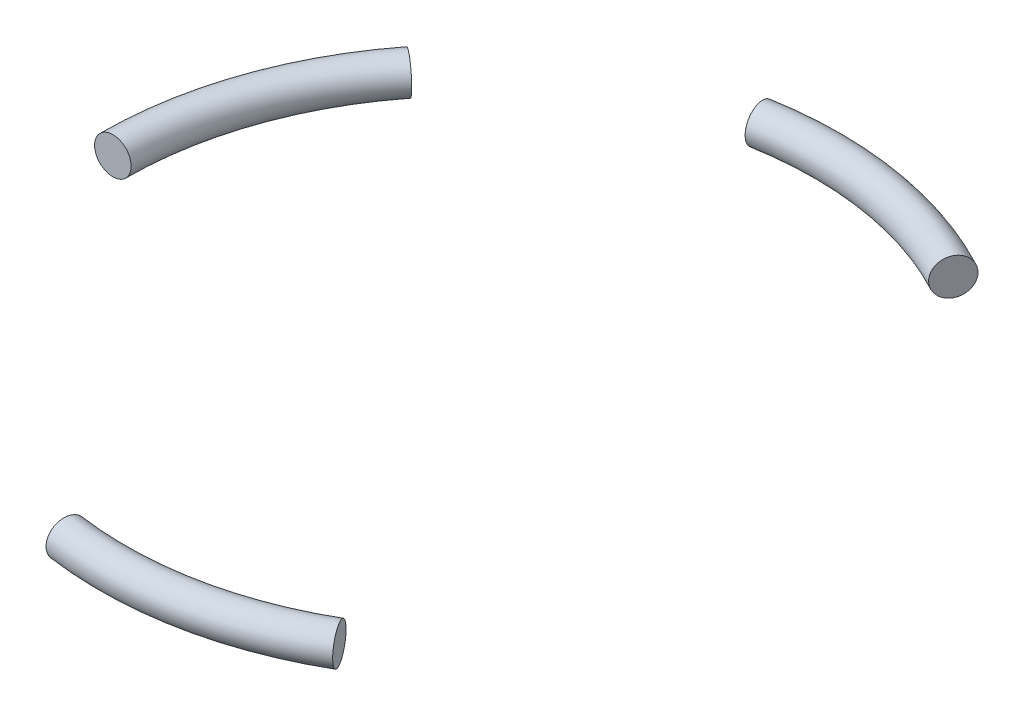
ISO-10303-21;
HEADER;
FILE_DESCRIPTION(('STEP AP214'),'2;1');
FILE_NAME('part.step','',(''),(''),'','','');
FILE_SCHEMA(('AUTOMOTIVE_DESIGN { 1 0 10303 214 1 1 1 1 }'));
ENDSEC;
DATA;
#1=APPLICATION_CONTEXT('core data for automotive mechanical design processes');
#2=APPLICATION_PROTOCOL_DEFINITION('international standard','automotive_design',2000,#1);
#3=PRODUCT_CONTEXT('',#1,'mechanical');
#4=PRODUCT('Part','Part','',(#3));
#5=PRODUCT_RELATED_PRODUCT_CATEGORY('part','',(#4));
#6=PRODUCT_DEFINITION_FORMATION('','',#4);
#7=PRODUCT_DEFINITION_CONTEXT('part definition',#1,'design');
#8=PRODUCT_DEFINITION('design','',#6,#7);
#9=PRODUCT_DEFINITION_SHAPE('','',#8);
#10=(LENGTH_UNIT() NAMED_UNIT(*) SI_UNIT(.MILLI.,.METRE.));
#11=(NAMED_UNIT(*) PLANE_ANGLE_UNIT() SI_UNIT($,.RADIAN.));
#12=(NAMED_UNIT(*) SI_UNIT($,.STERADIAN.) SOLID_ANGLE_UNIT());
#13=UNCERTAINTY_MEASURE_WITH_UNIT(LENGTH_MEASURE(1.E-05),#10,'distance_accuracy_value','');
#14=(GEOMETRIC_REPRESENTATION_CONTEXT(3) GLOBAL_UNCERTAINTY_ASSIGNED_CONTEXT((#13)) GLOBAL_UNIT_ASSIGNED_CONTEXT((#10,
#11,#12)) REPRESENTATION_CONTEXT('',''));
#15=CARTESIAN_POINT('',(0.,0.,0.));
#16=DIRECTION('',(0.,0.,1.));
#17=DIRECTION('',(1.,0.,0.));
#18=AXIS2_PLACEMENT_3D('',#15,#16,#17);
#19=CARTESIAN_POINT('',(0.,0.,0.));
#20=DIRECTION('',(-0.984807753012206,0.,0.173648177666941));
#21=DIRECTION('',(0.173648177666941,0.,0.984807753012206));
#22=AXIS2_PLACEMENT_3D('',#19,#20,#21);
#23=PLANE('',#22);
#24=CARTESIAN_POINT('',(-1.35879699024381,4.2698,-7.70612066732051));
#25=DIRECTION('',(-0.984807753012206,0.,0.173648177666941));
#26=DIRECTION('',(0.173648177666941,0.,0.984807753012206));
#27=AXIS2_PLACEMENT_3D('',#24,#25,#26);
#28=CIRCLE('',#27,0.4);
#29=CARTESIAN_POINT('',(-1.42825626131059,4.2698,-8.1000437685254));
#30=VERTEX_POINT('',#29);
#31=EDGE_CURVE('P0_E10',#30,#30,#28,.T.);
#32=ORIENTED_EDGE('',*,*,#31,.T.);
#33=EDGE_LOOP('',(#32));
#34=FACE_BOUND('',#33,.T.);
#35=ADVANCED_FACE('P0_F15',(#34),#23,.T.);
#36=CARTESIAN_POINT('',(0.,0.,0.));
#37=DIRECTION('',(-0.882947592858931,0.,-0.469471562785883));
#38=DIRECTION('',(-0.469471562785883,0.,0.882947592858931));
#39=AXIS2_PLACEMENT_3D('',#36,#37,#38);
#40=PLANE('',#39);
#41=CARTESIAN_POINT('',(3.67361497879953,4.2698,-6.90906491412113));
#42=DIRECTION('',(-0.882947592858931,0.,-0.469471562785883));
#43=DIRECTION('',(-0.469471562785883,0.,0.882947592858931));
#44=AXIS2_PLACEMENT_3D('',#41,#42,#43);
#45=CIRCLE('',#44,0.4);
#46=CARTESIAN_POINT('',(3.86140360391389,4.2698,-7.26224395126471));
#47=VERTEX_POINT('',#46);
#48=EDGE_CURVE('P0_E22',#47,#47,#45,.T.);
#49=ORIENTED_EDGE('',*,*,#48,.F.);
#50=EDGE_LOOP('',(#49));
#51=FACE_BOUND('',#50,.T.);
#52=ADVANCED_FACE('P0_F35',(#51),#40,.F.);
#53=CARTESIAN_POINT('',(0.,4.2698,0.));
#54=DIRECTION('',(0.,1.,0.));
#55=DIRECTION('',(-0.984807753012206,0.,0.173648177666941));
#56=AXIS2_PLACEMENT_3D('',#53,#54,#55);
#57=TOROIDAL_SURFACE('',#56,7.825,0.4);
#58=CARTESIAN_POINT('',(0.,4.2698,0.));
#59=DIRECTION('',(0.,1.,0.));
#60=DIRECTION('',(-0.984807753012206,0.,0.173648177666941));
#61=AXIS2_PLACEMENT_3D('',#58,#59,#60);
#62=CIRCLE('',#61,8.225);
#63=EDGE_CURVE('',#47,#30,#62,.T.);
#64=ORIENTED_EDGE('',*,*,#48,.T.);
#65=ORIENTED_EDGE('',*,*,#31,.F.);
#66=ORIENTED_EDGE('',*,*,#63,.T.);
#67=ORIENTED_EDGE('',*,*,#63,.F.);
#68=EDGE_LOOP('',(#64,#66,#65,#67));
#69=FACE_BOUND('',#68,.T.);
#70=ADVANCED_FACE('P0_F33',(#69),#57,.T.);
#71=CLOSED_SHELL('',(#35,#52,#70));
#72=MANIFOLD_SOLID_BREP('P0_B1',#71);
#73=CARTESIAN_POINT('',(0.,0.,0.));
#74=DIRECTION('',(0.866025403784436,0.,-0.5));
#75=DIRECTION('',(-0.5,0.,-0.866025403784436));
#76=AXIS2_PLACEMENT_3D('',#73,#74,#75);
#77=PLANE('',#76);
#78=CARTESIAN_POINT('',(3.9125,4.2698,6.77664878461321));
#79=DIRECTION('',(0.866025403784436,0.,-0.5));
#80=DIRECTION('',(-0.5,0.,-0.866025403784436));
#81=AXIS2_PLACEMENT_3D('',#78,#79,#80);
#82=CIRCLE('',#81,0.4);
#83=CARTESIAN_POINT('',(4.11250000000001,4.2698,7.123058946127));
#84=VERTEX_POINT('',#83);
#85=EDGE_CURVE('P1_E10',#84,#84,#82,.T.);
#86=ORIENTED_EDGE('',*,*,#85,.T.);
#87=EDGE_LOOP('',(#86));
#88=FACE_BOUND('',#87,.T.);
#89=ADVANCED_FACE('P1_F15',(#88),#77,.T.);
#90=CARTESIAN_POINT('',(0.,0.,0.));
#91=DIRECTION('',(0.990268068741571,0.,0.139173100960062));
#92=DIRECTION('',(0.139173100960062,0.,-0.990268068741571));
#93=AXIS2_PLACEMENT_3D('',#90,#91,#92);
#94=PLANE('',#93);
#95=CARTESIAN_POINT('',(-1.08902951501249,4.2698,7.74884763790279));
#96=DIRECTION('',(0.990268068741571,0.,0.139173100960062));
#97=DIRECTION('',(0.139173100960062,0.,-0.990268068741571));
#98=AXIS2_PLACEMENT_3D('',#95,#96,#97);
#99=CIRCLE('',#98,0.4);
#100=CARTESIAN_POINT('',(-1.14469875539651,4.2698,8.14495486539942));
#101=VERTEX_POINT('',#100);
#102=EDGE_CURVE('P1_E22',#101,#101,#99,.T.);
#103=ORIENTED_EDGE('',*,*,#102,.F.);
#104=EDGE_LOOP('',(#103));
#105=FACE_BOUND('',#104,.T.);
#106=ADVANCED_FACE('P1_F35',(#105),#94,.F.);
#107=CARTESIAN_POINT('',(0.,4.2698,0.));
#108=DIRECTION('',(0.,1.,0.));
#109=DIRECTION('',(0.866025403784436,0.,-0.5));
#110=AXIS2_PLACEMENT_3D('',#107,#108,#109);
#111=TOROIDAL_SURFACE('',#110,7.825,0.4);
#112=CARTESIAN_POINT('',(0.,4.2698,0.));
#113=DIRECTION('',(0.,1.,0.));
#114=DIRECTION('',(0.866025403784436,0.,-0.5));
#115=AXIS2_PLACEMENT_3D('',#112,#113,#114);
#116=CIRCLE('',#115,8.225);
#117=EDGE_CURVE('',#101,#84,#116,.T.);
#118=ORIENTED_EDGE('',*,*,#102,.T.);
#119=ORIENTED_EDGE('',*,*,#85,.F.);
#120=ORIENTED_EDGE('',*,*,#117,.T.);
#121=ORIENTED_EDGE('',*,*,#117,.F.);
#122=EDGE_LOOP('',(#118,#120,#119,#121));
#123=FACE_BOUND('',#122,.T.);
#124=ADVANCED_FACE('P1_F33',(#123),#111,.T.);
#125=CLOSED_SHELL('',(#89,#106,#124));
#126=MANIFOLD_SOLID_BREP('P1_B1',#125);
#127=CARTESIAN_POINT('',(0.,0.,0.));
#128=DIRECTION('',(0.,0.,1.));
#129=DIRECTION('',(1.,0.,0.));
#130=AXIS2_PLACEMENT_3D('',#127,#128,#129);
#131=PLANE('',#130);
#132=CARTESIAN_POINT('',(-7.825,4.2698,0.));
#133=DIRECTION('',(0.,0.,1.));
#134=DIRECTION('',(1.,0.,0.));
#135=AXIS2_PLACEMENT_3D('',#132,#133,#134);
#136=CIRCLE('',#135,0.4);
#137=CARTESIAN_POINT('',(-8.225,4.2698,0.));
#138=VERTEX_POINT('',#137);
#139=EDGE_CURVE('P2_E10',#138,#138,#136,.T.);
#140=ORIENTED_EDGE('',*,*,#139,.T.);
#141=EDGE_LOOP('',(#140));
#142=FACE_BOUND('',#141,.T.);
#143=ADVANCED_FACE('P2_F15',(#142),#131,.T.);
#144=CARTESIAN_POINT('',(0.,0.,0.));
#145=DIRECTION('',(-0.615661475325659,0.,0.788010753606721));
#146=DIRECTION('',(0.788010753606721,0.,0.615661475325659));
#147=AXIS2_PLACEMENT_3D('',#144,#145,#146);
#148=PLANE('',#147);
#149=CARTESIAN_POINT('',(-6.16618414697259,4.2698,-4.81755104442328));
#150=DIRECTION('',(-0.615661475325659,0.,0.788010753606721));
#151=DIRECTION('',(0.788010753606721,0.,0.61566147532566));
#152=AXIS2_PLACEMENT_3D('',#149,#150,#151);
#153=CIRCLE('',#152,0.4);
#154=CARTESIAN_POINT('',(-6.48138844841528,4.2698,-5.06381563455355));
#155=VERTEX_POINT('',#154);
#156=EDGE_CURVE('P2_E22',#155,#155,#153,.T.);
#157=ORIENTED_EDGE('',*,*,#156,.F.);
#158=EDGE_LOOP('',(#157));
#159=FACE_BOUND('',#158,.T.);
#160=ADVANCED_FACE('P2_F35',(#159),#148,.F.);
#161=CARTESIAN_POINT('',(0.,4.2698,0.));
#162=DIRECTION('',(0.,1.,0.));
#163=DIRECTION('',(0.,0.,1.));
#164=AXIS2_PLACEMENT_3D('',#161,#162,#163);
#165=TOROIDAL_SURFACE('',#164,7.825,0.4);
#166=CARTESIAN_POINT('',(0.,4.2698,0.));
#167=DIRECTION('',(0.,1.,0.));
#168=DIRECTION('',(0.,0.,1.));
#169=AXIS2_PLACEMENT_3D('',#166,#167,#168);
#170=CIRCLE('',#169,8.225);
#171=EDGE_CURVE('',#155,#138,#170,.T.);
#172=ORIENTED_EDGE('',*,*,#156,.T.);
#173=ORIENTED_EDGE('',*,*,#139,.F.);
#174=ORIENTED_EDGE('',*,*,#171,.T.);
#175=ORIENTED_EDGE('',*,*,#171,.F.);
#176=EDGE_LOOP('',(#172,#174,#173,#175));
#177=FACE_BOUND('',#176,.T.);
#178=ADVANCED_FACE('P2_F33',(#177),#165,.T.);
#179=CLOSED_SHELL('',(#143,#160,#178));
#180=MANIFOLD_SOLID_BREP('P2_B1',#179);
#181=ADVANCED_BREP_SHAPE_REPRESENTATION('',(#18,#72,#126,#180),#14);
#182=SHAPE_DEFINITION_REPRESENTATION(#9,#181);
ENDSEC;
END-ISO-10303-21;
